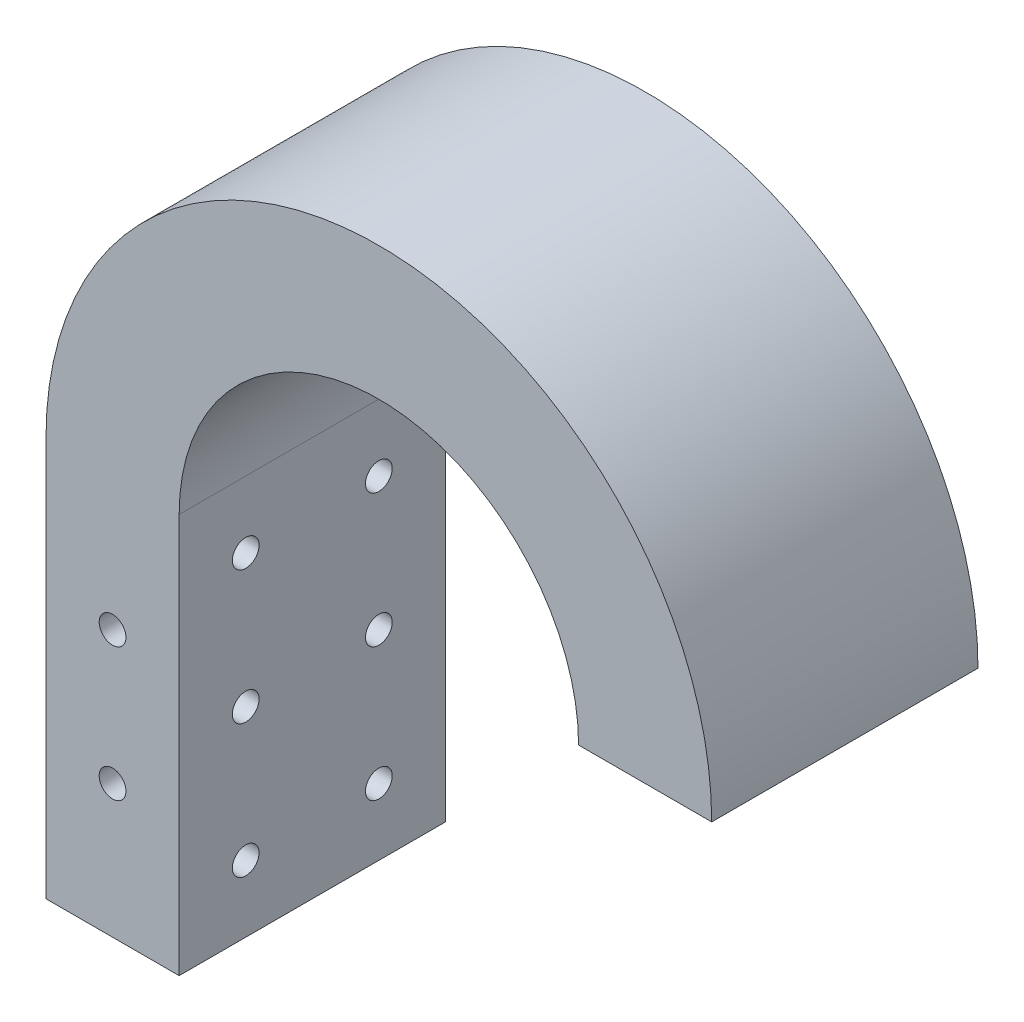
ISO-10303-21;
HEADER;
FILE_DESCRIPTION(('STEP AP214'),'2;1');
FILE_NAME('part.step','',(''),(''),'','','');
FILE_SCHEMA(('AUTOMOTIVE_DESIGN { 1 0 10303 214 1 1 1 1 }'));
ENDSEC;
DATA;
#1=APPLICATION_CONTEXT('core data for automotive mechanical design processes');
#2=APPLICATION_PROTOCOL_DEFINITION('international standard','automotive_design',2000,#1);
#3=PRODUCT_CONTEXT('',#1,'mechanical');
#4=PRODUCT('Part','Part','',(#3));
#5=PRODUCT_RELATED_PRODUCT_CATEGORY('part','',(#4));
#6=PRODUCT_DEFINITION_FORMATION('','',#4);
#7=PRODUCT_DEFINITION_CONTEXT('part definition',#1,'design');
#8=PRODUCT_DEFINITION('design','',#6,#7);
#9=PRODUCT_DEFINITION_SHAPE('','',#8);
#10=(LENGTH_UNIT() NAMED_UNIT(*) SI_UNIT(.MILLI.,.METRE.));
#11=(NAMED_UNIT(*) PLANE_ANGLE_UNIT() SI_UNIT($,.RADIAN.));
#12=(NAMED_UNIT(*) SI_UNIT($,.STERADIAN.) SOLID_ANGLE_UNIT());
#13=UNCERTAINTY_MEASURE_WITH_UNIT(LENGTH_MEASURE(1.E-05),#10,'distance_accuracy_value','');
#14=(GEOMETRIC_REPRESENTATION_CONTEXT(3) GLOBAL_UNCERTAINTY_ASSIGNED_CONTEXT((#13)) GLOBAL_UNIT_ASSIGNED_CONTEXT((#10,
#11,#12)) REPRESENTATION_CONTEXT('',''));
#15=CARTESIAN_POINT('',(0.,0.,0.));
#16=DIRECTION('',(0.,0.,1.));
#17=DIRECTION('',(1.,0.,0.));
#18=AXIS2_PLACEMENT_3D('',#15,#16,#17);
#19=CARTESIAN_POINT('',(25.4,0.,50.8));
#20=DIRECTION('',(-1.,0.,0.));
#21=DIRECTION('',(0.,0.,1.));
#22=AXIS2_PLACEMENT_3D('',#19,#20,#21);
#23=PLANE('',#22);
#24=CARTESIAN_POINT('',(25.4,63.5,38.1));
#25=DIRECTION('',(-1.,0.,0.));
#26=DIRECTION('',(0.,0.,1.));
#27=AXIS2_PLACEMENT_3D('',#24,#25,#26);
#28=CIRCLE('',#27,2.55269999999999);
#29=CARTESIAN_POINT('',(25.4,63.5,40.6527));
#30=VERTEX_POINT('',#29);
#31=EDGE_CURVE('E276',#30,#30,#28,.F.);
#32=ORIENTED_EDGE('',*,*,#31,.F.);
#33=EDGE_LOOP('',(#32));
#34=FACE_BOUND('',#33,.T.);
#35=CARTESIAN_POINT('',(25.4,12.7,38.1));
#36=DIRECTION('',(-1.,0.,0.));
#37=DIRECTION('',(0.,0.,1.));
#38=AXIS2_PLACEMENT_3D('',#35,#36,#37);
#39=CIRCLE('',#38,2.55269999999999);
#40=CARTESIAN_POINT('',(25.4,12.7,40.6527));
#41=VERTEX_POINT('',#40);
#42=EDGE_CURVE('E202',#41,#41,#39,.F.);
#43=ORIENTED_EDGE('',*,*,#42,.F.);
#44=EDGE_LOOP('',(#43));
#45=FACE_BOUND('',#44,.T.);
#46=CARTESIAN_POINT('',(25.4,38.1,38.1));
#47=DIRECTION('',(-1.,0.,0.));
#48=DIRECTION('',(0.,0.,1.));
#49=AXIS2_PLACEMENT_3D('',#46,#47,#48);
#50=CIRCLE('',#49,2.55269999999999);
#51=CARTESIAN_POINT('',(25.4,38.1,40.6527));
#52=VERTEX_POINT('',#51);
#53=EDGE_CURVE('E201',#52,#52,#50,.F.);
#54=ORIENTED_EDGE('',*,*,#53,.F.);
#55=EDGE_LOOP('',(#54));
#56=FACE_BOUND('',#55,.T.);
#57=DIRECTION('',(0.,1.,0.));
#58=VECTOR('',#57,1.);
#59=CARTESIAN_POINT('',(25.4,0.,0.));
#60=LINE('',#59,#58);
#61=CARTESIAN_POINT('',(25.4,0.,0.));
#62=VERTEX_POINT('',#61);
#63=CARTESIAN_POINT('',(25.4,76.2,0.));
#64=VERTEX_POINT('',#63);
#65=EDGE_CURVE('E127',#62,#64,#60,.T.);
#66=ORIENTED_EDGE('',*,*,#65,.T.);
#67=DIRECTION('',(0.,0.,-1.));
#68=VECTOR('',#67,1.);
#69=CARTESIAN_POINT('',(25.4,76.2,50.8));
#70=LINE('',#69,#68);
#71=CARTESIAN_POINT('',(25.4,76.2,50.8));
#72=VERTEX_POINT('',#71);
#73=EDGE_CURVE('E112',#72,#64,#70,.T.);
#74=ORIENTED_EDGE('',*,*,#73,.F.);
#75=DIRECTION('',(0.,1.,0.));
#76=VECTOR('',#75,1.);
#77=CARTESIAN_POINT('',(25.4,0.,50.8));
#78=LINE('',#77,#76);
#79=CARTESIAN_POINT('',(25.4,0.,50.8));
#80=VERTEX_POINT('',#79);
#81=EDGE_CURVE('E103',#80,#72,#78,.T.);
#82=ORIENTED_EDGE('',*,*,#81,.F.);
#83=DIRECTION('',(0.,0.,-1.));
#84=VECTOR('',#83,1.);
#85=CARTESIAN_POINT('',(25.4,0.,50.8));
#86=LINE('',#85,#84);
#87=EDGE_CURVE('E45',#80,#62,#86,.T.);
#88=ORIENTED_EDGE('',*,*,#87,.T.);
#89=EDGE_LOOP('',(#66,#74,#82,#88));
#90=FACE_BOUND('',#89,.T.);
#91=CARTESIAN_POINT('',(25.4,63.5,12.7));
#92=DIRECTION('',(-1.,0.,0.));
#93=DIRECTION('',(0.,0.,1.));
#94=AXIS2_PLACEMENT_3D('',#91,#92,#93);
#95=CIRCLE('',#94,2.55269999999999);
#96=CARTESIAN_POINT('',(25.4,63.5,15.2527));
#97=VERTEX_POINT('',#96);
#98=EDGE_CURVE('E272',#97,#97,#95,.F.);
#99=ORIENTED_EDGE('',*,*,#98,.F.);
#100=EDGE_LOOP('',(#99));
#101=FACE_BOUND('',#100,.T.);
#102=CARTESIAN_POINT('',(25.4,12.7,12.7));
#103=DIRECTION('',(-1.,0.,0.));
#104=DIRECTION('',(0.,0.,1.));
#105=AXIS2_PLACEMENT_3D('',#102,#103,#104);
#106=CIRCLE('',#105,2.55269999999999);
#107=CARTESIAN_POINT('',(25.4,12.7,15.2527));
#108=VERTEX_POINT('',#107);
#109=EDGE_CURVE('E268',#108,#108,#106,.F.);
#110=ORIENTED_EDGE('',*,*,#109,.F.);
#111=EDGE_LOOP('',(#110));
#112=FACE_BOUND('',#111,.T.);
#113=CARTESIAN_POINT('',(25.4,38.1,12.7));
#114=DIRECTION('',(-1.,0.,0.));
#115=DIRECTION('',(0.,0.,1.));
#116=AXIS2_PLACEMENT_3D('',#113,#114,#115);
#117=CIRCLE('',#116,2.55269999999999);
#118=CARTESIAN_POINT('',(25.4,38.1,15.2527));
#119=VERTEX_POINT('',#118);
#120=EDGE_CURVE('E264',#119,#119,#117,.F.);
#121=ORIENTED_EDGE('',*,*,#120,.F.);
#122=EDGE_LOOP('',(#121));
#123=FACE_BOUND('',#122,.T.);
#124=ADVANCED_FACE('F36',(#34,#45,#56,#90,#101,#112,#123),#23,.F.);
#125=CARTESIAN_POINT('',(63.5,76.2,0.));
#126=DIRECTION('',(0.,0.,-1.));
#127=DIRECTION('',(-1.,0.,0.));
#128=AXIS2_PLACEMENT_3D('',#125,#126,#127);
#129=PLANE('',#128);
#130=CARTESIAN_POINT('',(12.7,25.4,0.));
#131=DIRECTION('',(0.,0.,-1.));
#132=DIRECTION('',(-1.,0.,0.));
#133=AXIS2_PLACEMENT_3D('',#130,#131,#132);
#134=CIRCLE('',#133,2.55269999999999);
#135=CARTESIAN_POINT('',(10.1473,25.4,0.));
#136=VERTEX_POINT('',#135);
#137=EDGE_CURVE('E125',#136,#136,#134,.F.);
#138=ORIENTED_EDGE('',*,*,#137,.T.);
#139=EDGE_LOOP('',(#138));
#140=FACE_BOUND('',#139,.T.);
#141=DIRECTION('',(0.,-1.,0.));
#142=VECTOR('',#141,1.);
#143=CARTESIAN_POINT('',(0.,0.,0.));
#144=LINE('',#143,#142);
#145=CARTESIAN_POINT('',(0.,76.2,0.));
#146=VERTEX_POINT('',#145);
#147=CARTESIAN_POINT('',(0.,0.,0.));
#148=VERTEX_POINT('',#147);
#149=EDGE_CURVE('E121',#146,#148,#144,.T.);
#150=ORIENTED_EDGE('',*,*,#149,.F.);
#151=CARTESIAN_POINT('',(63.5,76.2,0.));
#152=DIRECTION('',(0.,0.,1.));
#153=DIRECTION('',(-1.,0.,0.));
#154=AXIS2_PLACEMENT_3D('',#151,#152,#153);
#155=CIRCLE('',#154,63.5);
#156=CARTESIAN_POINT('',(127.,76.2,0.));
#157=VERTEX_POINT('',#156);
#158=EDGE_CURVE('E82',#157,#146,#155,.T.);
#159=ORIENTED_EDGE('',*,*,#158,.F.);
#160=DIRECTION('',(1.,0.,0.));
#161=VECTOR('',#160,1.);
#162=CARTESIAN_POINT('',(101.6,76.2,0.));
#163=LINE('',#162,#161);
#164=CARTESIAN_POINT('',(101.6,76.2,0.));
#165=VERTEX_POINT('',#164);
#166=EDGE_CURVE('E76',#165,#157,#163,.T.);
#167=ORIENTED_EDGE('',*,*,#166,.F.);
#168=CARTESIAN_POINT('',(63.5,76.2,0.));
#169=DIRECTION('',(0.,0.,-1.));
#170=DIRECTION('',(-1.,0.,0.));
#171=AXIS2_PLACEMENT_3D('',#168,#169,#170);
#172=CIRCLE('',#171,38.1);
#173=EDGE_CURVE('E111',#64,#165,#172,.T.);
#174=ORIENTED_EDGE('',*,*,#173,.F.);
#175=ORIENTED_EDGE('',*,*,#65,.F.);
#176=DIRECTION('',(1.,0.,0.));
#177=VECTOR('',#176,1.);
#178=CARTESIAN_POINT('',(0.,0.,0.));
#179=LINE('',#178,#177);
#180=EDGE_CURVE('E124',#148,#62,#179,.T.);
#181=ORIENTED_EDGE('',*,*,#180,.F.);
#182=EDGE_LOOP('',(#150,#159,#167,#174,#175,#181));
#183=FACE_BOUND('',#182,.T.);
#184=CARTESIAN_POINT('',(12.7,50.8,0.));
#185=DIRECTION('',(0.,0.,-1.));
#186=DIRECTION('',(-1.,0.,0.));
#187=AXIS2_PLACEMENT_3D('',#184,#185,#186);
#188=CIRCLE('',#187,2.55269999999999);
#189=CARTESIAN_POINT('',(10.1473,50.8,0.));
#190=VERTEX_POINT('',#189);
#191=EDGE_CURVE('E213',#190,#190,#188,.F.);
#192=ORIENTED_EDGE('',*,*,#191,.T.);
#193=EDGE_LOOP('',(#192));
#194=FACE_BOUND('',#193,.T.);
#195=ADVANCED_FACE('F141',(#140,#183,#194),#129,.T.);
#196=CARTESIAN_POINT('',(0.,0.,50.8));
#197=DIRECTION('',(1.,0.,0.));
#198=DIRECTION('',(0.,0.,-1.));
#199=AXIS2_PLACEMENT_3D('',#196,#197,#198);
#200=PLANE('',#199);
#201=CARTESIAN_POINT('',(0.,38.1,12.7));
#202=DIRECTION('',(-1.,0.,0.));
#203=DIRECTION('',(0.,0.,1.));
#204=AXIS2_PLACEMENT_3D('',#201,#202,#203);
#205=CIRCLE('',#204,2.55269999999999);
#206=CARTESIAN_POINT('',(0.,38.1,15.2527));
#207=VERTEX_POINT('',#206);
#208=EDGE_CURVE('E180',#207,#207,#205,.T.);
#209=ORIENTED_EDGE('',*,*,#208,.F.);
#210=EDGE_LOOP('',(#209));
#211=FACE_BOUND('',#210,.T.);
#212=CARTESIAN_POINT('',(0.,12.7,12.7));
#213=DIRECTION('',(-1.,0.,0.));
#214=DIRECTION('',(0.,0.,1.));
#215=AXIS2_PLACEMENT_3D('',#212,#213,#214);
#216=CIRCLE('',#215,2.55269999999999);
#217=CARTESIAN_POINT('',(0.,12.7,15.2527));
#218=VERTEX_POINT('',#217);
#219=EDGE_CURVE('E184',#218,#218,#216,.T.);
#220=ORIENTED_EDGE('',*,*,#219,.F.);
#221=EDGE_LOOP('',(#220));
#222=FACE_BOUND('',#221,.T.);
#223=CARTESIAN_POINT('',(0.,63.5,12.7));
#224=DIRECTION('',(-1.,0.,0.));
#225=DIRECTION('',(0.,0.,1.));
#226=AXIS2_PLACEMENT_3D('',#223,#224,#225);
#227=CIRCLE('',#226,2.55269999999999);
#228=CARTESIAN_POINT('',(0.,63.5,15.2527));
#229=VERTEX_POINT('',#228);
#230=EDGE_CURVE('E188',#229,#229,#227,.T.);
#231=ORIENTED_EDGE('',*,*,#230,.F.);
#232=EDGE_LOOP('',(#231));
#233=FACE_BOUND('',#232,.T.);
#234=CARTESIAN_POINT('',(0.,63.5,38.1));
#235=DIRECTION('',(-1.,0.,0.));
#236=DIRECTION('',(0.,0.,1.));
#237=AXIS2_PLACEMENT_3D('',#234,#235,#236);
#238=CIRCLE('',#237,2.55269999999999);
#239=CARTESIAN_POINT('',(0.,63.5,40.6527));
#240=VERTEX_POINT('',#239);
#241=EDGE_CURVE('E192',#240,#240,#238,.T.);
#242=ORIENTED_EDGE('',*,*,#241,.F.);
#243=EDGE_LOOP('',(#242));
#244=FACE_BOUND('',#243,.T.);
#245=CARTESIAN_POINT('',(0.,12.7,38.1));
#246=DIRECTION('',(-1.,0.,0.));
#247=DIRECTION('',(0.,0.,1.));
#248=AXIS2_PLACEMENT_3D('',#245,#246,#247);
#249=CIRCLE('',#248,2.55269999999999);
#250=CARTESIAN_POINT('',(0.,12.7,40.6527));
#251=VERTEX_POINT('',#250);
#252=EDGE_CURVE('E196',#251,#251,#249,.T.);
#253=ORIENTED_EDGE('',*,*,#252,.F.);
#254=EDGE_LOOP('',(#253));
#255=FACE_BOUND('',#254,.T.);
#256=CARTESIAN_POINT('',(0.,38.1,38.1));
#257=DIRECTION('',(-1.,0.,0.));
#258=DIRECTION('',(0.,0.,1.));
#259=AXIS2_PLACEMENT_3D('',#256,#257,#258);
#260=CIRCLE('',#259,2.55269999999999);
#261=CARTESIAN_POINT('',(0.,38.1,40.6527));
#262=VERTEX_POINT('',#261);
#263=EDGE_CURVE('E199',#262,#262,#260,.T.);
#264=ORIENTED_EDGE('',*,*,#263,.F.);
#265=EDGE_LOOP('',(#264));
#266=FACE_BOUND('',#265,.T.);
#267=ORIENTED_EDGE('',*,*,#149,.T.);
#268=DIRECTION('',(0.,0.,-1.));
#269=VECTOR('',#268,1.);
#270=CARTESIAN_POINT('',(0.,0.,50.8));
#271=LINE('',#270,#269);
#272=CARTESIAN_POINT('',(0.,0.,50.8));
#273=VERTEX_POINT('',#272);
#274=EDGE_CURVE('E11',#273,#148,#271,.T.);
#275=ORIENTED_EDGE('',*,*,#274,.F.);
#276=DIRECTION('',(0.,-1.,0.));
#277=VECTOR('',#276,1.);
#278=CARTESIAN_POINT('',(0.,0.,50.8));
#279=LINE('',#278,#277);
#280=CARTESIAN_POINT('',(0.,76.2,50.8));
#281=VERTEX_POINT('',#280);
#282=EDGE_CURVE('E132',#281,#273,#279,.T.);
#283=ORIENTED_EDGE('',*,*,#282,.F.);
#284=DIRECTION('',(0.,0.,-1.));
#285=VECTOR('',#284,1.);
#286=CARTESIAN_POINT('',(0.,76.2,50.8));
#287=LINE('',#286,#285);
#288=EDGE_CURVE('E117',#281,#146,#287,.T.);
#289=ORIENTED_EDGE('',*,*,#288,.T.);
#290=EDGE_LOOP('',(#267,#275,#283,#289));
#291=FACE_BOUND('',#290,.T.);
#292=ADVANCED_FACE('F38',(#211,#222,#233,#244,#255,#266,#291),#200,.F.);
#293=CARTESIAN_POINT('',(0.,0.,50.8));
#294=DIRECTION('',(0.,1.,0.));
#295=DIRECTION('',(0.,0.,1.));
#296=AXIS2_PLACEMENT_3D('',#293,#294,#295);
#297=PLANE('',#296);
#298=ORIENTED_EDGE('',*,*,#180,.T.);
#299=ORIENTED_EDGE('',*,*,#87,.F.);
#300=DIRECTION('',(1.,0.,0.));
#301=VECTOR('',#300,1.);
#302=CARTESIAN_POINT('',(0.,0.,50.8));
#303=LINE('',#302,#301);
#304=EDGE_CURVE('E90',#273,#80,#303,.T.);
#305=ORIENTED_EDGE('',*,*,#304,.F.);
#306=ORIENTED_EDGE('',*,*,#274,.T.);
#307=EDGE_LOOP('',(#298,#299,#305,#306));
#308=FACE_BOUND('',#307,.T.);
#309=ADVANCED_FACE('F168',(#308),#297,.F.);
#310=CARTESIAN_POINT('',(63.5,76.2,50.8));
#311=DIRECTION('',(0.,0.,-1.));
#312=DIRECTION('',(-1.,0.,0.));
#313=AXIS2_PLACEMENT_3D('',#310,#311,#312);
#314=CYLINDRICAL_SURFACE('',#313,38.1);
#315=ORIENTED_EDGE('',*,*,#173,.T.);
#316=DIRECTION('',(0.,0.,-1.));
#317=VECTOR('',#316,1.);
#318=CARTESIAN_POINT('',(101.6,76.2,50.8));
#319=LINE('',#318,#317);
#320=CARTESIAN_POINT('',(101.6,76.2,50.8));
#321=VERTEX_POINT('',#320);
#322=EDGE_CURVE('E108',#321,#165,#319,.T.);
#323=ORIENTED_EDGE('',*,*,#322,.F.);
#324=CARTESIAN_POINT('',(63.5,76.2,50.8));
#325=DIRECTION('',(0.,0.,-1.));
#326=DIRECTION('',(-1.,0.,0.));
#327=AXIS2_PLACEMENT_3D('',#324,#325,#326);
#328=CIRCLE('',#327,38.1);
#329=EDGE_CURVE('E97',#72,#321,#328,.T.);
#330=ORIENTED_EDGE('',*,*,#329,.F.);
#331=ORIENTED_EDGE('',*,*,#73,.T.);
#332=EDGE_LOOP('',(#315,#323,#330,#331));
#333=FACE_BOUND('',#332,.T.);
#334=ADVANCED_FACE('F109',(#333),#314,.F.);
#335=CARTESIAN_POINT('',(101.6,76.2,50.8));
#336=DIRECTION('',(0.,1.,0.));
#337=DIRECTION('',(0.,0.,1.));
#338=AXIS2_PLACEMENT_3D('',#335,#336,#337);
#339=PLANE('',#338);
#340=ORIENTED_EDGE('',*,*,#166,.T.);
#341=DIRECTION('',(0.,0.,-1.));
#342=VECTOR('',#341,1.);
#343=CARTESIAN_POINT('',(127.,76.2,50.8));
#344=LINE('',#343,#342);
#345=CARTESIAN_POINT('',(127.,76.2,50.8));
#346=VERTEX_POINT('',#345);
#347=EDGE_CURVE('E113',#346,#157,#344,.T.);
#348=ORIENTED_EDGE('',*,*,#347,.F.);
#349=DIRECTION('',(1.,0.,0.));
#350=VECTOR('',#349,1.);
#351=CARTESIAN_POINT('',(101.6,76.2,50.8));
#352=LINE('',#351,#350);
#353=EDGE_CURVE('E101',#321,#346,#352,.T.);
#354=ORIENTED_EDGE('',*,*,#353,.F.);
#355=ORIENTED_EDGE('',*,*,#322,.T.);
#356=EDGE_LOOP('',(#340,#348,#354,#355));
#357=FACE_BOUND('',#356,.T.);
#358=ADVANCED_FACE('F115',(#357),#339,.F.);
#359=CARTESIAN_POINT('',(63.5,76.2,50.8));
#360=DIRECTION('',(0.,0.,-1.));
#361=DIRECTION('',(-1.,0.,0.));
#362=AXIS2_PLACEMENT_3D('',#359,#360,#361);
#363=CYLINDRICAL_SURFACE('',#362,63.5);
#364=ORIENTED_EDGE('',*,*,#158,.T.);
#365=ORIENTED_EDGE('',*,*,#288,.F.);
#366=CARTESIAN_POINT('',(63.5,76.2,50.8));
#367=DIRECTION('',(0.,0.,1.));
#368=DIRECTION('',(-1.,0.,0.));
#369=AXIS2_PLACEMENT_3D('',#366,#367,#368);
#370=CIRCLE('',#369,63.5);
#371=EDGE_CURVE('E53',#346,#281,#370,.T.);
#372=ORIENTED_EDGE('',*,*,#371,.F.);
#373=ORIENTED_EDGE('',*,*,#347,.T.);
#374=EDGE_LOOP('',(#364,#365,#372,#373));
#375=FACE_BOUND('',#374,.T.);
#376=ADVANCED_FACE('F146',(#375),#363,.T.);
#377=CARTESIAN_POINT('',(63.5,76.2,50.8));
#378=DIRECTION('',(0.,0.,-1.));
#379=DIRECTION('',(-1.,0.,0.));
#380=AXIS2_PLACEMENT_3D('',#377,#378,#379);
#381=PLANE('',#380);
#382=CARTESIAN_POINT('',(12.7,50.8,50.8));
#383=DIRECTION('',(0.,0.,1.));
#384=DIRECTION('',(1.,0.,0.));
#385=AXIS2_PLACEMENT_3D('',#382,#383,#384);
#386=CIRCLE('',#385,2.55269999999999);
#387=CARTESIAN_POINT('',(15.2527,50.8,50.8));
#388=VERTEX_POINT('',#387);
#389=EDGE_CURVE('E205',#388,#388,#386,.T.);
#390=ORIENTED_EDGE('',*,*,#389,.F.);
#391=EDGE_LOOP('',(#390));
#392=FACE_BOUND('',#391,.T.);
#393=CARTESIAN_POINT('',(12.7,25.4,50.8));
#394=DIRECTION('',(0.,0.,1.));
#395=DIRECTION('',(1.,0.,0.));
#396=AXIS2_PLACEMENT_3D('',#393,#394,#395);
#397=CIRCLE('',#396,2.55269999999999);
#398=CARTESIAN_POINT('',(15.2527,25.4,50.8));
#399=VERTEX_POINT('',#398);
#400=EDGE_CURVE('E216',#399,#399,#397,.T.);
#401=ORIENTED_EDGE('',*,*,#400,.F.);
#402=EDGE_LOOP('',(#401));
#403=FACE_BOUND('',#402,.T.);
#404=ORIENTED_EDGE('',*,*,#282,.T.);
#405=ORIENTED_EDGE('',*,*,#304,.T.);
#406=ORIENTED_EDGE('',*,*,#81,.T.);
#407=ORIENTED_EDGE('',*,*,#329,.T.);
#408=ORIENTED_EDGE('',*,*,#353,.T.);
#409=ORIENTED_EDGE('',*,*,#371,.T.);
#410=EDGE_LOOP('',(#404,#405,#406,#407,#408,#409));
#411=FACE_BOUND('',#410,.T.);
#412=ADVANCED_FACE('F99',(#392,#403,#411),#381,.F.);
#413=CARTESIAN_POINT('',(12.7,25.4,50.8));
#414=DIRECTION('',(0.,0.,1.));
#415=DIRECTION('',(1.,0.,0.));
#416=AXIS2_PLACEMENT_3D('',#413,#414,#415);
#417=CYLINDRICAL_SURFACE('',#416,2.55269999999999);
#418=ORIENTED_EDGE('',*,*,#137,.F.);
#419=EDGE_LOOP('',(#418));
#420=FACE_BOUND('',#419,.T.);
#421=ORIENTED_EDGE('',*,*,#400,.T.);
#422=EDGE_LOOP('',(#421));
#423=FACE_BOUND('',#422,.T.);
#424=ADVANCED_FACE('F153',(#420,#423),#417,.F.);
#425=CARTESIAN_POINT('',(12.7,50.8,50.8));
#426=DIRECTION('',(0.,0.,1.));
#427=DIRECTION('',(1.,0.,0.));
#428=AXIS2_PLACEMENT_3D('',#425,#426,#427);
#429=CYLINDRICAL_SURFACE('',#428,2.55269999999999);
#430=ORIENTED_EDGE('',*,*,#191,.F.);
#431=EDGE_LOOP('',(#430));
#432=FACE_BOUND('',#431,.T.);
#433=ORIENTED_EDGE('',*,*,#389,.T.);
#434=EDGE_LOOP('',(#433));
#435=FACE_BOUND('',#434,.T.);
#436=ADVANCED_FACE('F226',(#432,#435),#429,.F.);
#437=CARTESIAN_POINT('',(0.,38.1,38.1));
#438=DIRECTION('',(-1.,0.,0.));
#439=DIRECTION('',(0.,0.,1.));
#440=AXIS2_PLACEMENT_3D('',#437,#438,#439);
#441=CYLINDRICAL_SURFACE('',#440,2.55269999999999);
#442=ORIENTED_EDGE('',*,*,#53,.T.);
#443=EDGE_LOOP('',(#442));
#444=FACE_BOUND('',#443,.T.);
#445=ORIENTED_EDGE('',*,*,#263,.T.);
#446=EDGE_LOOP('',(#445));
#447=FACE_BOUND('',#446,.T.);
#448=ADVANCED_FACE('F233',(#444,#447),#441,.F.);
#449=CARTESIAN_POINT('',(0.,12.7,38.1));
#450=DIRECTION('',(-1.,0.,0.));
#451=DIRECTION('',(0.,0.,1.));
#452=AXIS2_PLACEMENT_3D('',#449,#450,#451);
#453=CYLINDRICAL_SURFACE('',#452,2.55269999999999);
#454=ORIENTED_EDGE('',*,*,#42,.T.);
#455=EDGE_LOOP('',(#454));
#456=FACE_BOUND('',#455,.T.);
#457=ORIENTED_EDGE('',*,*,#252,.T.);
#458=EDGE_LOOP('',(#457));
#459=FACE_BOUND('',#458,.T.);
#460=ADVANCED_FACE('F239',(#456,#459),#453,.F.);
#461=CARTESIAN_POINT('',(0.,63.5,38.1));
#462=DIRECTION('',(-1.,0.,0.));
#463=DIRECTION('',(0.,0.,1.));
#464=AXIS2_PLACEMENT_3D('',#461,#462,#463);
#465=CYLINDRICAL_SURFACE('',#464,2.55269999999999);
#466=ORIENTED_EDGE('',*,*,#31,.T.);
#467=EDGE_LOOP('',(#466));
#468=FACE_BOUND('',#467,.T.);
#469=ORIENTED_EDGE('',*,*,#241,.T.);
#470=EDGE_LOOP('',(#469));
#471=FACE_BOUND('',#470,.T.);
#472=ADVANCED_FACE('F243',(#468,#471),#465,.F.);
#473=CARTESIAN_POINT('',(0.,63.5,12.7));
#474=DIRECTION('',(-1.,0.,0.));
#475=DIRECTION('',(0.,0.,1.));
#476=AXIS2_PLACEMENT_3D('',#473,#474,#475);
#477=CYLINDRICAL_SURFACE('',#476,2.55269999999999);
#478=ORIENTED_EDGE('',*,*,#98,.T.);
#479=EDGE_LOOP('',(#478));
#480=FACE_BOUND('',#479,.T.);
#481=ORIENTED_EDGE('',*,*,#230,.T.);
#482=EDGE_LOOP('',(#481));
#483=FACE_BOUND('',#482,.T.);
#484=ADVANCED_FACE('F247',(#480,#483),#477,.F.);
#485=CARTESIAN_POINT('',(0.,12.7,12.7));
#486=DIRECTION('',(-1.,0.,0.));
#487=DIRECTION('',(0.,0.,1.));
#488=AXIS2_PLACEMENT_3D('',#485,#486,#487);
#489=CYLINDRICAL_SURFACE('',#488,2.55269999999999);
#490=ORIENTED_EDGE('',*,*,#109,.T.);
#491=EDGE_LOOP('',(#490));
#492=FACE_BOUND('',#491,.T.);
#493=ORIENTED_EDGE('',*,*,#219,.T.);
#494=EDGE_LOOP('',(#493));
#495=FACE_BOUND('',#494,.T.);
#496=ADVANCED_FACE('F251',(#492,#495),#489,.F.);
#497=CARTESIAN_POINT('',(0.,38.1,12.7));
#498=DIRECTION('',(-1.,0.,0.));
#499=DIRECTION('',(0.,0.,1.));
#500=AXIS2_PLACEMENT_3D('',#497,#498,#499);
#501=CYLINDRICAL_SURFACE('',#500,2.55269999999999);
#502=ORIENTED_EDGE('',*,*,#120,.T.);
#503=EDGE_LOOP('',(#502));
#504=FACE_BOUND('',#503,.T.);
#505=ORIENTED_EDGE('',*,*,#208,.T.);
#506=EDGE_LOOP('',(#505));
#507=FACE_BOUND('',#506,.T.);
#508=ADVANCED_FACE('F255',(#504,#507),#501,.F.);
#509=CLOSED_SHELL('',(#124,#195,#292,#309,#334,#358,#376,#412,#424,#436,#448,#460,#472,#484,
#496,#508));
#510=MANIFOLD_SOLID_BREP('B2',#509);
#511=ADVANCED_BREP_SHAPE_REPRESENTATION('',(#18,#510),#14);
#512=SHAPE_DEFINITION_REPRESENTATION(#9,#511);
ENDSEC;
END-ISO-10303-21;
